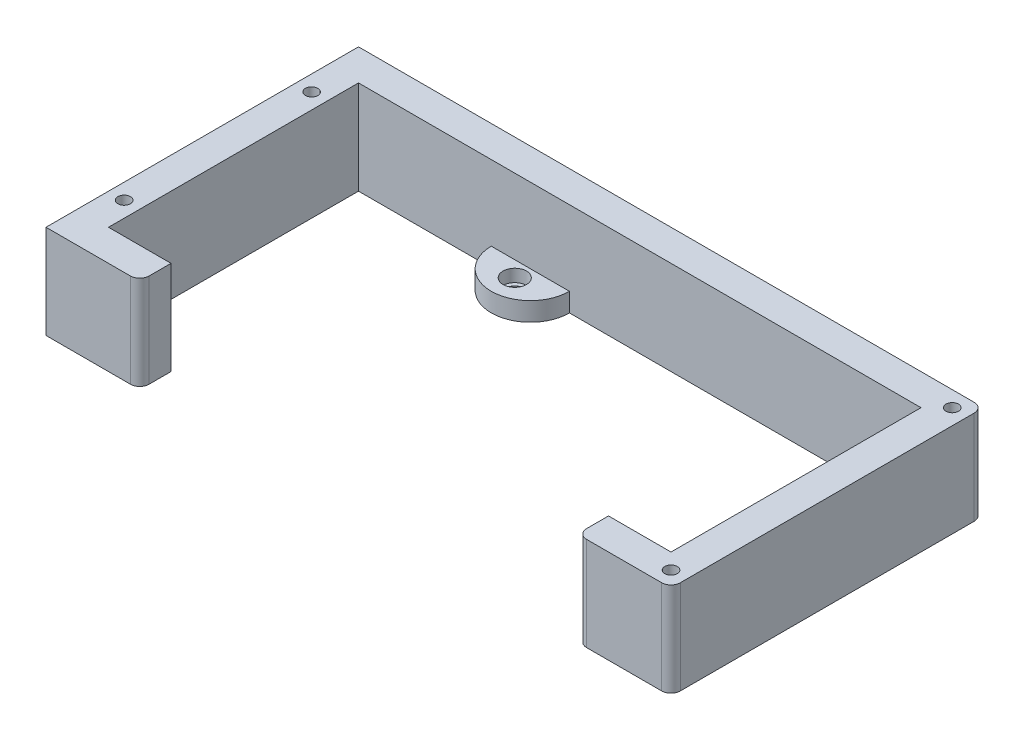
ISO-10303-21;
HEADER;
FILE_DESCRIPTION(('STEP AP214'),'2;1');
FILE_NAME('part.step','',(''),(''),'','','');
FILE_SCHEMA(('AUTOMOTIVE_DESIGN { 1 0 10303 214 1 1 1 1 }'));
ENDSEC;
DATA;
#1=APPLICATION_CONTEXT('core data for automotive mechanical design processes');
#2=APPLICATION_PROTOCOL_DEFINITION('international standard','automotive_design',2000,#1);
#3=PRODUCT_CONTEXT('',#1,'mechanical');
#4=PRODUCT('Part','Part','',(#3));
#5=PRODUCT_RELATED_PRODUCT_CATEGORY('part','',(#4));
#6=PRODUCT_DEFINITION_FORMATION('','',#4);
#7=PRODUCT_DEFINITION_CONTEXT('part definition',#1,'design');
#8=PRODUCT_DEFINITION('design','',#6,#7);
#9=PRODUCT_DEFINITION_SHAPE('','',#8);
#10=(LENGTH_UNIT() NAMED_UNIT(*) SI_UNIT(.MILLI.,.METRE.));
#11=(NAMED_UNIT(*) PLANE_ANGLE_UNIT() SI_UNIT($,.RADIAN.));
#12=(NAMED_UNIT(*) SI_UNIT($,.STERADIAN.) SOLID_ANGLE_UNIT());
#13=UNCERTAINTY_MEASURE_WITH_UNIT(LENGTH_MEASURE(1.E-05),#10,'distance_accuracy_value','');
#14=(GEOMETRIC_REPRESENTATION_CONTEXT(3) GLOBAL_UNCERTAINTY_ASSIGNED_CONTEXT((#13)) GLOBAL_UNIT_ASSIGNED_CONTEXT((#10,
#11,#12)) REPRESENTATION_CONTEXT('',''));
#15=CARTESIAN_POINT('',(0.,0.,0.));
#16=DIRECTION('',(0.,0.,1.));
#17=DIRECTION('',(1.,0.,0.));
#18=AXIS2_PLACEMENT_3D('',#15,#16,#17);
#19=CARTESIAN_POINT('',(-90.,30.,40.));
#20=DIRECTION('',(0.,0.,-1.));
#21=DIRECTION('',(-1.,0.,0.));
#22=AXIS2_PLACEMENT_3D('',#19,#20,#21);
#23=PLANE('',#22);
#24=DIRECTION('',(0.,1.,0.));
#25=VECTOR('',#24,1.);
#26=CARTESIAN_POINT('',(70.,0.,40.));
#27=LINE('',#26,#25);
#28=CARTESIAN_POINT('',(70.,0.,40.));
#29=VERTEX_POINT('',#28);
#30=CARTESIAN_POINT('',(70.,30.,40.));
#31=VERTEX_POINT('',#30);
#32=EDGE_CURVE('E201',#29,#31,#27,.T.);
#33=ORIENTED_EDGE('',*,*,#32,.T.);
#34=DIRECTION('',(1.,0.,0.));
#35=VECTOR('',#34,1.);
#36=CARTESIAN_POINT('',(-90.,30.,40.));
#37=LINE('',#36,#35);
#38=CARTESIAN_POINT('',(90.,30.,40.));
#39=VERTEX_POINT('',#38);
#40=EDGE_CURVE('E419',#31,#39,#37,.T.);
#41=ORIENTED_EDGE('',*,*,#40,.T.);
#42=DIRECTION('',(0.,-1.,0.));
#43=VECTOR('',#42,1.);
#44=CARTESIAN_POINT('',(90.,30.,40.));
#45=LINE('',#44,#43);
#46=CARTESIAN_POINT('',(90.,6.,40.));
#47=VERTEX_POINT('',#46);
#48=EDGE_CURVE('E228',#39,#47,#45,.T.);
#49=ORIENTED_EDGE('',*,*,#48,.T.);
#50=DIRECTION('',(1.,0.,0.));
#51=VECTOR('',#50,1.);
#52=CARTESIAN_POINT('',(77.5,6.,39.9999999999999));
#53=LINE('',#52,#51);
#54=CARTESIAN_POINT('',(77.5,6.,39.9999999999999));
#55=VERTEX_POINT('',#54);
#56=EDGE_CURVE('E387',#55,#47,#53,.T.);
#57=ORIENTED_EDGE('',*,*,#56,.F.);
#58=DIRECTION('',(0.,-1.,0.));
#59=VECTOR('',#58,1.);
#60=CARTESIAN_POINT('',(77.5,6.,39.9999999999999));
#61=LINE('',#60,#59);
#62=CARTESIAN_POINT('',(77.5,0.,39.9999999999999));
#63=VERTEX_POINT('',#62);
#64=EDGE_CURVE('E212',#55,#63,#61,.T.);
#65=ORIENTED_EDGE('',*,*,#64,.T.);
#66=DIRECTION('',(1.,0.,0.));
#67=VECTOR('',#66,1.);
#68=CARTESIAN_POINT('',(-90.,0.,40.));
#69=LINE('',#68,#67);
#70=EDGE_CURVE('E189',#29,#63,#69,.T.);
#71=ORIENTED_EDGE('',*,*,#70,.F.);
#72=EDGE_LOOP('',(#33,#41,#49,#57,#65,#71));
#73=FACE_BOUND('',#72,.T.);
#74=ADVANCED_FACE('F34',(#73),#23,.T.);
#75=CARTESIAN_POINT('',(-100.,30.,50.));
#76=DIRECTION('',(0.,0.,-1.));
#77=DIRECTION('',(-1.,0.,0.));
#78=AXIS2_PLACEMENT_3D('',#75,#76,#77);
#79=PLANE('',#78);
#80=DIRECTION('',(1.,0.,0.));
#81=VECTOR('',#80,1.);
#82=CARTESIAN_POINT('',(-100.,0.,50.));
#83=LINE('',#82,#81);
#84=CARTESIAN_POINT('',(73.,0.,50.));
#85=VERTEX_POINT('',#84);
#86=CARTESIAN_POINT('',(96.9999999999999,0.,50.));
#87=VERTEX_POINT('',#86);
#88=EDGE_CURVE('E256',#85,#87,#83,.T.);
#89=ORIENTED_EDGE('',*,*,#88,.T.);
#90=DIRECTION('',(0.,-1.,0.));
#91=VECTOR('',#90,1.);
#92=CARTESIAN_POINT('',(97.,30.,50.));
#93=LINE('',#92,#91);
#94=CARTESIAN_POINT('',(96.9999999999999,30.,50.));
#95=VERTEX_POINT('',#94);
#96=EDGE_CURVE('E289',#87,#95,#93,.F.);
#97=ORIENTED_EDGE('',*,*,#96,.T.);
#98=DIRECTION('',(1.,0.,0.));
#99=VECTOR('',#98,1.);
#100=CARTESIAN_POINT('',(-100.,30.,50.));
#101=LINE('',#100,#99);
#102=CARTESIAN_POINT('',(73.,30.,50.));
#103=VERTEX_POINT('',#102);
#104=EDGE_CURVE('E246',#103,#95,#101,.T.);
#105=ORIENTED_EDGE('',*,*,#104,.F.);
#106=DIRECTION('',(0.,1.,0.));
#107=VECTOR('',#106,1.);
#108=CARTESIAN_POINT('',(73.,30.,50.));
#109=LINE('',#108,#107);
#110=EDGE_CURVE('E287',#103,#85,#109,.F.);
#111=ORIENTED_EDGE('',*,*,#110,.T.);
#112=EDGE_LOOP('',(#89,#97,#105,#111));
#113=FACE_BOUND('',#112,.T.);
#114=ADVANCED_FACE('F456',(#113),#79,.F.);
#115=CARTESIAN_POINT('',(85.,6.,-35.));
#116=DIRECTION('',(0.,-1.,0.));
#117=DIRECTION('',(0.,0.,-1.));
#118=AXIS2_PLACEMENT_3D('',#115,#116,#117);
#119=CYLINDRICAL_SURFACE('',#118,2.50000000000001);
#120=CARTESIAN_POINT('',(85.,0.,-35.));
#121=DIRECTION('',(0.,1.,0.));
#122=DIRECTION('',(0.,0.,1.));
#123=AXIS2_PLACEMENT_3D('',#120,#121,#122);
#124=CIRCLE('',#123,2.50000000000001);
#125=CARTESIAN_POINT('',(85.,0.,-32.5));
#126=VERTEX_POINT('',#125);
#127=EDGE_CURVE('E398',#126,#126,#124,.T.);
#128=ORIENTED_EDGE('',*,*,#127,.F.);
#129=EDGE_LOOP('',(#128));
#130=FACE_BOUND('',#129,.T.);
#131=CARTESIAN_POINT('',(85.,2.,-35.));
#132=DIRECTION('',(0.,1.,0.));
#133=DIRECTION('',(0.,0.,1.));
#134=AXIS2_PLACEMENT_3D('',#131,#132,#133);
#135=CIRCLE('',#134,2.50000000000001);
#136=CARTESIAN_POINT('',(85.,2.,-32.5));
#137=VERTEX_POINT('',#136);
#138=EDGE_CURVE('E272',#137,#137,#135,.T.);
#139=ORIENTED_EDGE('',*,*,#138,.T.);
#140=EDGE_LOOP('',(#139));
#141=FACE_BOUND('',#140,.T.);
#142=ADVANCED_FACE('F460',(#130,#141),#119,.F.);
#143=CARTESIAN_POINT('',(-35.,6.,-35.));
#144=DIRECTION('',(0.,-1.,0.));
#145=DIRECTION('',(0.,0.,-1.));
#146=AXIS2_PLACEMENT_3D('',#143,#144,#145);
#147=CYLINDRICAL_SURFACE('',#146,2.5);
#148=CARTESIAN_POINT('',(-35.,0.,-35.));
#149=DIRECTION('',(0.,1.,0.));
#150=DIRECTION('',(0.,0.,1.));
#151=AXIS2_PLACEMENT_3D('',#148,#149,#150);
#152=CIRCLE('',#151,2.5);
#153=CARTESIAN_POINT('',(-35.,0.,-32.5));
#154=VERTEX_POINT('',#153);
#155=EDGE_CURVE('E275',#154,#154,#152,.T.);
#156=ORIENTED_EDGE('',*,*,#155,.F.);
#157=EDGE_LOOP('',(#156));
#158=FACE_BOUND('',#157,.T.);
#159=CARTESIAN_POINT('',(-35.,2.,-35.));
#160=DIRECTION('',(0.,1.,0.));
#161=DIRECTION('',(0.,0.,1.));
#162=AXIS2_PLACEMENT_3D('',#159,#160,#161);
#163=CIRCLE('',#162,2.5);
#164=CARTESIAN_POINT('',(-35.,2.,-32.5));
#165=VERTEX_POINT('',#164);
#166=EDGE_CURVE('E265',#165,#165,#163,.T.);
#167=ORIENTED_EDGE('',*,*,#166,.T.);
#168=EDGE_LOOP('',(#167));
#169=FACE_BOUND('',#168,.T.);
#170=ADVANCED_FACE('F452',(#158,#169),#147,.F.);
#171=CARTESIAN_POINT('',(-90.,30.,-40.));
#172=DIRECTION('',(0.,0.,1.));
#173=DIRECTION('',(1.,0.,0.));
#174=AXIS2_PLACEMENT_3D('',#171,#172,#173);
#175=PLANE('',#174);
#176=DIRECTION('',(-1.,0.,0.));
#177=VECTOR('',#176,1.);
#178=CARTESIAN_POINT('',(-90.,0.,-40.));
#179=LINE('',#178,#177);
#180=CARTESIAN_POINT('',(-47.5,0.,-39.999999999996));
#181=VERTEX_POINT('',#180);
#182=CARTESIAN_POINT('',(-90.,0.,-40.));
#183=VERTEX_POINT('',#182);
#184=EDGE_CURVE('E415',#181,#183,#179,.T.);
#185=ORIENTED_EDGE('',*,*,#184,.F.);
#186=DIRECTION('',(0.,-1.,0.));
#187=VECTOR('',#186,1.);
#188=CARTESIAN_POINT('',(-47.5,6.,-39.999999999996));
#189=LINE('',#188,#187);
#190=CARTESIAN_POINT('',(-47.5,6.,-39.999999999996));
#191=VERTEX_POINT('',#190);
#192=EDGE_CURVE('E377',#191,#181,#189,.T.);
#193=ORIENTED_EDGE('',*,*,#192,.F.);
#194=DIRECTION('',(-1.,0.,0.));
#195=VECTOR('',#194,1.);
#196=CARTESIAN_POINT('',(-47.5,6.,-39.999999999996));
#197=LINE('',#196,#195);
#198=CARTESIAN_POINT('',(-22.5,6.,-39.999999999996));
#199=VERTEX_POINT('',#198);
#200=EDGE_CURVE('E375',#199,#191,#197,.T.);
#201=ORIENTED_EDGE('',*,*,#200,.F.);
#202=DIRECTION('',(0.,-1.,0.));
#203=VECTOR('',#202,1.);
#204=CARTESIAN_POINT('',(-22.5,6.,-39.999999999996));
#205=LINE('',#204,#203);
#206=CARTESIAN_POINT('',(-22.5,0.,-40.));
#207=VERTEX_POINT('',#206);
#208=EDGE_CURVE('E380',#199,#207,#205,.T.);
#209=ORIENTED_EDGE('',*,*,#208,.T.);
#210=CARTESIAN_POINT('',(77.5,0.,-39.9999999999999));
#211=VERTEX_POINT('',#210);
#212=EDGE_CURVE('E219',#211,#207,#179,.T.);
#213=ORIENTED_EDGE('',*,*,#212,.F.);
#214=DIRECTION('',(0.,-1.,0.));
#215=VECTOR('',#214,1.);
#216=CARTESIAN_POINT('',(77.5,6.,-39.9999999999999));
#217=LINE('',#216,#215);
#218=CARTESIAN_POINT('',(77.5,6.,-39.9999999999999));
#219=VERTEX_POINT('',#218);
#220=EDGE_CURVE('E413',#219,#211,#217,.T.);
#221=ORIENTED_EDGE('',*,*,#220,.F.);
#222=DIRECTION('',(-1.,0.,0.));
#223=VECTOR('',#222,1.);
#224=CARTESIAN_POINT('',(77.5,6.,-39.9999999999999));
#225=LINE('',#224,#223);
#226=CARTESIAN_POINT('',(90.,6.,-40.));
#227=VERTEX_POINT('',#226);
#228=EDGE_CURVE('E404',#227,#219,#225,.T.);
#229=ORIENTED_EDGE('',*,*,#228,.F.);
#230=DIRECTION('',(0.,-1.,0.));
#231=VECTOR('',#230,1.);
#232=CARTESIAN_POINT('',(90.,30.,-40.));
#233=LINE('',#232,#231);
#234=CARTESIAN_POINT('',(90.,30.,-40.));
#235=VERTEX_POINT('',#234);
#236=EDGE_CURVE('E225',#235,#227,#233,.T.);
#237=ORIENTED_EDGE('',*,*,#236,.F.);
#238=DIRECTION('',(-1.,0.,0.));
#239=VECTOR('',#238,1.);
#240=CARTESIAN_POINT('',(-90.,30.,-40.));
#241=LINE('',#240,#239);
#242=CARTESIAN_POINT('',(-90.,30.,-40.));
#243=VERTEX_POINT('',#242);
#244=EDGE_CURVE('E224',#235,#243,#241,.T.);
#245=ORIENTED_EDGE('',*,*,#244,.T.);
#246=DIRECTION('',(0.,-1.,0.));
#247=VECTOR('',#246,1.);
#248=CARTESIAN_POINT('',(-90.,30.,-40.));
#249=LINE('',#248,#247);
#250=EDGE_CURVE('E234',#243,#183,#249,.T.);
#251=ORIENTED_EDGE('',*,*,#250,.T.);
#252=EDGE_LOOP('',(#185,#193,#201,#209,#213,#221,#229,#237,#245,#251));
#253=FACE_BOUND('',#252,.T.);
#254=ADVANCED_FACE('F436',(#253),#175,.T.);
#255=DIRECTION('',(0.,1.,0.));
#256=VECTOR('',#255,1.);
#257=CARTESIAN_POINT('',(-70.,0.,40.));
#258=LINE('',#257,#256);
#259=CARTESIAN_POINT('',(-70.,0.,40.));
#260=VERTEX_POINT('',#259);
#261=CARTESIAN_POINT('',(-70.,30.,40.));
#262=VERTEX_POINT('',#261);
#263=EDGE_CURVE('E207',#260,#262,#258,.T.);
#264=ORIENTED_EDGE('',*,*,#263,.F.);
#265=CARTESIAN_POINT('',(-90.,0.,40.));
#266=VERTEX_POINT('',#265);
#267=EDGE_CURVE('E213',#266,#260,#69,.T.);
#268=ORIENTED_EDGE('',*,*,#267,.F.);
#269=DIRECTION('',(0.,-1.,0.));
#270=VECTOR('',#269,1.);
#271=CARTESIAN_POINT('',(-90.,30.,40.));
#272=LINE('',#271,#270);
#273=CARTESIAN_POINT('',(-90.,30.,40.));
#274=VERTEX_POINT('',#273);
#275=EDGE_CURVE('E232',#274,#266,#272,.T.);
#276=ORIENTED_EDGE('',*,*,#275,.F.);
#277=EDGE_CURVE('E420',#274,#262,#37,.T.);
#278=ORIENTED_EDGE('',*,*,#277,.T.);
#279=EDGE_LOOP('',(#264,#268,#276,#278));
#280=FACE_BOUND('',#279,.T.);
#281=ADVANCED_FACE('F442',(#280),#23,.T.);
#282=CARTESIAN_POINT('',(90.,30.,-40.));
#283=DIRECTION('',(-1.,0.,0.));
#284=DIRECTION('',(0.,0.,1.));
#285=AXIS2_PLACEMENT_3D('',#282,#283,#284);
#286=PLANE('',#285);
#287=DIRECTION('',(0.,-1.,0.));
#288=VECTOR('',#287,1.);
#289=CARTESIAN_POINT('',(90.0000000000001,6.,27.5));
#290=LINE('',#289,#288);
#291=CARTESIAN_POINT('',(90.,6.,27.5));
#292=VERTEX_POINT('',#291);
#293=CARTESIAN_POINT('',(90.0000000000001,0.,27.5));
#294=VERTEX_POINT('',#293);
#295=EDGE_CURVE('E396',#292,#294,#290,.T.);
#296=ORIENTED_EDGE('',*,*,#295,.F.);
#297=DIRECTION('',(0.,0.,-1.));
#298=VECTOR('',#297,1.);
#299=CARTESIAN_POINT('',(90.,6.,40.));
#300=LINE('',#299,#298);
#301=EDGE_CURVE('E389',#47,#292,#300,.T.);
#302=ORIENTED_EDGE('',*,*,#301,.F.);
#303=ORIENTED_EDGE('',*,*,#48,.F.);
#304=DIRECTION('',(0.,0.,-1.));
#305=VECTOR('',#304,1.);
#306=CARTESIAN_POINT('',(90.,30.,-40.));
#307=LINE('',#306,#305);
#308=EDGE_CURVE('E229',#39,#235,#307,.T.);
#309=ORIENTED_EDGE('',*,*,#308,.T.);
#310=ORIENTED_EDGE('',*,*,#236,.T.);
#311=DIRECTION('',(0.,0.,-1.));
#312=VECTOR('',#311,1.);
#313=CARTESIAN_POINT('',(90.,6.,-40.));
#314=LINE('',#313,#312);
#315=CARTESIAN_POINT('',(90.,6.,-27.5));
#316=VERTEX_POINT('',#315);
#317=EDGE_CURVE('E402',#316,#227,#314,.T.);
#318=ORIENTED_EDGE('',*,*,#317,.F.);
#319=DIRECTION('',(0.,-1.,0.));
#320=VECTOR('',#319,1.);
#321=CARTESIAN_POINT('',(90.,6.,-27.5));
#322=LINE('',#321,#320);
#323=CARTESIAN_POINT('',(90.,0.,-27.5));
#324=VERTEX_POINT('',#323);
#325=EDGE_CURVE('E408',#316,#324,#322,.T.);
#326=ORIENTED_EDGE('',*,*,#325,.T.);
#327=DIRECTION('',(0.,0.,-1.));
#328=VECTOR('',#327,1.);
#329=CARTESIAN_POINT('',(90.,0.,-40.));
#330=LINE('',#329,#328);
#331=EDGE_CURVE('E217',#294,#324,#330,.T.);
#332=ORIENTED_EDGE('',*,*,#331,.F.);
#333=EDGE_LOOP('',(#296,#302,#303,#309,#310,#318,#326,#332));
#334=FACE_BOUND('',#333,.T.);
#335=ADVANCED_FACE('F444',(#334),#286,.T.);
#336=CARTESIAN_POINT('',(0.,30.,0.));
#337=DIRECTION('',(0.,1.,0.));
#338=DIRECTION('',(0.,0.,1.));
#339=AXIS2_PLACEMENT_3D('',#336,#337,#338);
#340=PLANE('',#339);
#341=ORIENTED_EDGE('',*,*,#104,.T.);
#342=CARTESIAN_POINT('',(97.,30.,47.));
#343=DIRECTION('',(0.,1.,0.));
#344=DIRECTION('',(0.,0.,1.));
#345=AXIS2_PLACEMENT_3D('',#342,#343,#344);
#346=CIRCLE('',#345,3.);
#347=CARTESIAN_POINT('',(100.,30.,47.));
#348=VERTEX_POINT('',#347);
#349=EDGE_CURVE('E296',#95,#348,#346,.T.);
#350=ORIENTED_EDGE('',*,*,#349,.T.);
#351=DIRECTION('',(0.,0.,-1.));
#352=VECTOR('',#351,1.);
#353=CARTESIAN_POINT('',(100.,30.,-50.));
#354=LINE('',#353,#352);
#355=CARTESIAN_POINT('',(100.,30.,-47.));
#356=VERTEX_POINT('',#355);
#357=EDGE_CURVE('E238',#348,#356,#354,.T.);
#358=ORIENTED_EDGE('',*,*,#357,.T.);
#359=CARTESIAN_POINT('',(97.,30.,-47.));
#360=DIRECTION('',(0.,1.,0.));
#361=DIRECTION('',(0.,0.,1.));
#362=AXIS2_PLACEMENT_3D('',#359,#360,#361);
#363=CIRCLE('',#362,3.);
#364=CARTESIAN_POINT('',(97.,30.,-50.));
#365=VERTEX_POINT('',#364);
#366=EDGE_CURVE('E294',#356,#365,#363,.T.);
#367=ORIENTED_EDGE('',*,*,#366,.T.);
#368=DIRECTION('',(-1.,0.,0.));
#369=VECTOR('',#368,1.);
#370=CARTESIAN_POINT('',(-100.,30.,-50.));
#371=LINE('',#370,#369);
#372=CARTESIAN_POINT('',(-100.,30.,-50.));
#373=VERTEX_POINT('',#372);
#374=EDGE_CURVE('E241',#365,#373,#371,.T.);
#375=ORIENTED_EDGE('',*,*,#374,.T.);
#376=DIRECTION('',(0.,0.,1.));
#377=VECTOR('',#376,1.);
#378=CARTESIAN_POINT('',(-100.,30.,-50.));
#379=LINE('',#378,#377);
#380=CARTESIAN_POINT('',(-100.,30.,50.));
#381=VERTEX_POINT('',#380);
#382=EDGE_CURVE('E244',#373,#381,#379,.T.);
#383=ORIENTED_EDGE('',*,*,#382,.T.);
#384=CARTESIAN_POINT('',(-73.,30.,50.));
#385=VERTEX_POINT('',#384);
#386=EDGE_CURVE('E247',#381,#385,#101,.T.);
#387=ORIENTED_EDGE('',*,*,#386,.T.);
#388=CARTESIAN_POINT('',(-73.,30.,47.));
#389=DIRECTION('',(0.,1.,0.));
#390=DIRECTION('',(0.,0.,1.));
#391=AXIS2_PLACEMENT_3D('',#388,#389,#390);
#392=CIRCLE('',#391,3.);
#393=CARTESIAN_POINT('',(-70.,30.,47.));
#394=VERTEX_POINT('',#393);
#395=EDGE_CURVE('E49',#385,#394,#392,.T.);
#396=ORIENTED_EDGE('',*,*,#395,.T.);
#397=DIRECTION('',(0.,0.,1.));
#398=VECTOR('',#397,1.);
#399=CARTESIAN_POINT('',(-70.,30.,40.));
#400=LINE('',#399,#398);
#401=EDGE_CURVE('E198',#262,#394,#400,.T.);
#402=ORIENTED_EDGE('',*,*,#401,.F.);
#403=ORIENTED_EDGE('',*,*,#277,.F.);
#404=DIRECTION('',(0.,0.,1.));
#405=VECTOR('',#404,1.);
#406=CARTESIAN_POINT('',(-90.,30.,-40.));
#407=LINE('',#406,#405);
#408=EDGE_CURVE('E417',#243,#274,#407,.T.);
#409=ORIENTED_EDGE('',*,*,#408,.F.);
#410=ORIENTED_EDGE('',*,*,#244,.F.);
#411=ORIENTED_EDGE('',*,*,#308,.F.);
#412=ORIENTED_EDGE('',*,*,#40,.F.);
#413=DIRECTION('',(0.,0.,-1.));
#414=VECTOR('',#413,1.);
#415=CARTESIAN_POINT('',(70.,30.,40.));
#416=LINE('',#415,#414);
#417=CARTESIAN_POINT('',(70.,30.,47.));
#418=VERTEX_POINT('',#417);
#419=EDGE_CURVE('E204',#418,#31,#416,.T.);
#420=ORIENTED_EDGE('',*,*,#419,.F.);
#421=CARTESIAN_POINT('',(73.,30.,47.));
#422=DIRECTION('',(0.,1.,0.));
#423=DIRECTION('',(0.,0.,1.));
#424=AXIS2_PLACEMENT_3D('',#421,#422,#423);
#425=CIRCLE('',#424,3.);
#426=EDGE_CURVE('E292',#418,#103,#425,.T.);
#427=ORIENTED_EDGE('',*,*,#426,.T.);
#428=EDGE_LOOP('',(#341,#350,#358,#367,#375,#383,#387,#396,#402,#403,#409,#410,#411,#412,#420,#427));
#429=FACE_BOUND('',#428,.T.);
#430=CARTESIAN_POINT('',(95.,30.,-45.));
#431=DIRECTION('',(0.,1.,0.));
#432=DIRECTION('',(0.,0.,1.));
#433=AXIS2_PLACEMENT_3D('',#430,#431,#432);
#434=CIRCLE('',#433,2.);
#435=CARTESIAN_POINT('',(95.,30.,-43.));
#436=VERTEX_POINT('',#435);
#437=EDGE_CURVE('E334',#436,#436,#434,.T.);
#438=ORIENTED_EDGE('',*,*,#437,.F.);
#439=EDGE_LOOP('',(#438));
#440=FACE_BOUND('',#439,.T.);
#441=CARTESIAN_POINT('',(-95.,30.,30.));
#442=DIRECTION('',(0.,1.,0.));
#443=DIRECTION('',(0.,0.,-1.));
#444=AXIS2_PLACEMENT_3D('',#441,#442,#443);
#445=CIRCLE('',#444,2.);
#446=CARTESIAN_POINT('',(-95.,30.,28.));
#447=VERTEX_POINT('',#446);
#448=EDGE_CURVE('E328',#447,#447,#445,.T.);
#449=ORIENTED_EDGE('',*,*,#448,.F.);
#450=EDGE_LOOP('',(#449));
#451=FACE_BOUND('',#450,.T.);
#452=CARTESIAN_POINT('',(-95.,30.,-30.));
#453=DIRECTION('',(0.,1.,0.));
#454=DIRECTION('',(0.,0.,1.));
#455=AXIS2_PLACEMENT_3D('',#452,#453,#454);
#456=CIRCLE('',#455,2.);
#457=CARTESIAN_POINT('',(-95.,30.,-28.));
#458=VERTEX_POINT('',#457);
#459=EDGE_CURVE('E341',#458,#458,#456,.T.);
#460=ORIENTED_EDGE('',*,*,#459,.F.);
#461=EDGE_LOOP('',(#460));
#462=FACE_BOUND('',#461,.T.);
#463=CARTESIAN_POINT('',(95.,30.,45.));
#464=DIRECTION('',(0.,1.,0.));
#465=DIRECTION('',(0.,0.,-1.));
#466=AXIS2_PLACEMENT_3D('',#463,#464,#465);
#467=CIRCLE('',#466,2.);
#468=CARTESIAN_POINT('',(95.,30.,43.));
#469=VERTEX_POINT('',#468);
#470=EDGE_CURVE('E346',#469,#469,#467,.T.);
#471=ORIENTED_EDGE('',*,*,#470,.F.);
#472=EDGE_LOOP('',(#471));
#473=FACE_BOUND('',#472,.T.);
#474=ADVANCED_FACE('F308',(#429,#440,#451,#462,#473),#340,.T.);
#475=CARTESIAN_POINT('',(0.,0.,0.));
#476=DIRECTION('',(0.,1.,0.));
#477=DIRECTION('',(0.,0.,1.));
#478=AXIS2_PLACEMENT_3D('',#475,#476,#477);
#479=PLANE('',#478);
#480=DIRECTION('',(0.,0.,-1.));
#481=VECTOR('',#480,1.);
#482=CARTESIAN_POINT('',(100.,0.,-50.));
#483=LINE('',#482,#481);
#484=CARTESIAN_POINT('',(100.,0.,47.));
#485=VERTEX_POINT('',#484);
#486=CARTESIAN_POINT('',(100.,0.,-47.));
#487=VERTEX_POINT('',#486);
#488=EDGE_CURVE('E237',#485,#487,#483,.T.);
#489=ORIENTED_EDGE('',*,*,#488,.F.);
#490=CARTESIAN_POINT('',(97.,0.,47.));
#491=DIRECTION('',(0.,1.,0.));
#492=DIRECTION('',(0.,0.,1.));
#493=AXIS2_PLACEMENT_3D('',#490,#491,#492);
#494=CIRCLE('',#493,3.);
#495=EDGE_CURVE('E285',#485,#87,#494,.F.);
#496=ORIENTED_EDGE('',*,*,#495,.T.);
#497=ORIENTED_EDGE('',*,*,#88,.F.);
#498=CARTESIAN_POINT('',(73.,0.,47.));
#499=DIRECTION('',(0.,1.,0.));
#500=DIRECTION('',(0.,0.,1.));
#501=AXIS2_PLACEMENT_3D('',#498,#499,#500);
#502=CIRCLE('',#501,3.);
#503=CARTESIAN_POINT('',(70.,0.,47.));
#504=VERTEX_POINT('',#503);
#505=EDGE_CURVE('E193',#85,#504,#502,.F.);
#506=ORIENTED_EDGE('',*,*,#505,.T.);
#507=DIRECTION('',(0.,0.,-1.));
#508=VECTOR('',#507,1.);
#509=CARTESIAN_POINT('',(70.,0.,40.));
#510=LINE('',#509,#508);
#511=EDGE_CURVE('E182',#504,#29,#510,.T.);
#512=ORIENTED_EDGE('',*,*,#511,.T.);
#513=ORIENTED_EDGE('',*,*,#70,.T.);
#514=CARTESIAN_POINT('',(90.,0.,40.));
#515=DIRECTION('',(0.,1.,0.));
#516=DIRECTION('',(0.,0.,-1.));
#517=AXIS2_PLACEMENT_3D('',#514,#515,#516);
#518=CIRCLE('',#517,12.5);
#519=EDGE_CURVE('E386',#294,#63,#518,.T.);
#520=ORIENTED_EDGE('',*,*,#519,.F.);
#521=ORIENTED_EDGE('',*,*,#331,.T.);
#522=CARTESIAN_POINT('',(90.,0.,-40.));
#523=DIRECTION('',(0.,1.,0.));
#524=DIRECTION('',(0.,0.,1.));
#525=AXIS2_PLACEMENT_3D('',#522,#523,#524);
#526=CIRCLE('',#525,12.5);
#527=EDGE_CURVE('E401',#211,#324,#526,.T.);
#528=ORIENTED_EDGE('',*,*,#527,.F.);
#529=ORIENTED_EDGE('',*,*,#212,.T.);
#530=CARTESIAN_POINT('',(-35.,0.,-39.999999999996));
#531=DIRECTION('',(0.,1.,0.));
#532=DIRECTION('',(0.,0.,1.));
#533=AXIS2_PLACEMENT_3D('',#530,#531,#532);
#534=CIRCLE('',#533,12.5);
#535=EDGE_CURVE('E372',#181,#207,#534,.T.);
#536=ORIENTED_EDGE('',*,*,#535,.F.);
#537=ORIENTED_EDGE('',*,*,#184,.T.);
#538=DIRECTION('',(0.,0.,1.));
#539=VECTOR('',#538,1.);
#540=CARTESIAN_POINT('',(-90.,0.,-40.));
#541=LINE('',#540,#539);
#542=EDGE_CURVE('E214',#183,#266,#541,.T.);
#543=ORIENTED_EDGE('',*,*,#542,.T.);
#544=ORIENTED_EDGE('',*,*,#267,.T.);
#545=DIRECTION('',(0.,0.,1.));
#546=VECTOR('',#545,1.);
#547=CARTESIAN_POINT('',(-70.,0.,40.));
#548=LINE('',#547,#546);
#549=CARTESIAN_POINT('',(-70.,0.,47.));
#550=VERTEX_POINT('',#549);
#551=EDGE_CURVE('E197',#260,#550,#548,.T.);
#552=ORIENTED_EDGE('',*,*,#551,.T.);
#553=CARTESIAN_POINT('',(-73.,0.,47.));
#554=DIRECTION('',(0.,1.,0.));
#555=DIRECTION('',(0.,0.,1.));
#556=AXIS2_PLACEMENT_3D('',#553,#554,#555);
#557=CIRCLE('',#556,3.);
#558=CARTESIAN_POINT('',(-73.,0.,50.));
#559=VERTEX_POINT('',#558);
#560=EDGE_CURVE('E280',#550,#559,#557,.F.);
#561=ORIENTED_EDGE('',*,*,#560,.T.);
#562=CARTESIAN_POINT('',(-100.,0.,50.));
#563=VERTEX_POINT('',#562);
#564=EDGE_CURVE('E242',#563,#559,#83,.T.);
#565=ORIENTED_EDGE('',*,*,#564,.F.);
#566=DIRECTION('',(0.,0.,1.));
#567=VECTOR('',#566,1.);
#568=CARTESIAN_POINT('',(-100.,0.,-50.));
#569=LINE('',#568,#567);
#570=CARTESIAN_POINT('',(-100.,0.,-50.));
#571=VERTEX_POINT('',#570);
#572=EDGE_CURVE('E254',#571,#563,#569,.T.);
#573=ORIENTED_EDGE('',*,*,#572,.F.);
#574=DIRECTION('',(-1.,0.,0.));
#575=VECTOR('',#574,1.);
#576=CARTESIAN_POINT('',(-100.,0.,-50.));
#577=LINE('',#576,#575);
#578=CARTESIAN_POINT('',(97.,0.,-50.));
#579=VERTEX_POINT('',#578);
#580=EDGE_CURVE('E252',#579,#571,#577,.T.);
#581=ORIENTED_EDGE('',*,*,#580,.F.);
#582=CARTESIAN_POINT('',(97.,0.,-47.));
#583=DIRECTION('',(0.,1.,0.));
#584=DIRECTION('',(0.,0.,1.));
#585=AXIS2_PLACEMENT_3D('',#582,#583,#584);
#586=CIRCLE('',#585,3.);
#587=EDGE_CURVE('E283',#579,#487,#586,.F.);
#588=ORIENTED_EDGE('',*,*,#587,.T.);
#589=EDGE_LOOP('',(#489,#496,#497,#506,#512,#513,#520,#521,#528,#529,#536,#537,#543,#544,#552,
#561,#565,#573,#581,#588));
#590=FACE_BOUND('',#589,.T.);
#591=ORIENTED_EDGE('',*,*,#127,.T.);
#592=EDGE_LOOP('',(#591));
#593=FACE_BOUND('',#592,.T.);
#594=CARTESIAN_POINT('',(85.,0.,35.));
#595=DIRECTION('',(0.,1.,0.));
#596=DIRECTION('',(0.,0.,-1.));
#597=AXIS2_PLACEMENT_3D('',#594,#595,#596);
#598=CIRCLE('',#597,2.50000000000001);
#599=CARTESIAN_POINT('',(85.,0.,32.5));
#600=VERTEX_POINT('',#599);
#601=EDGE_CURVE('E383',#600,#600,#598,.T.);
#602=ORIENTED_EDGE('',*,*,#601,.T.);
#603=EDGE_LOOP('',(#602));
#604=FACE_BOUND('',#603,.T.);
#605=ORIENTED_EDGE('',*,*,#155,.T.);
#606=EDGE_LOOP('',(#605));
#607=FACE_BOUND('',#606,.T.);
#608=ADVANCED_FACE('F185',(#590,#593,#604,#607),#479,.F.);
#609=CARTESIAN_POINT('',(100.,30.,-50.));
#610=DIRECTION('',(-1.,0.,0.));
#611=DIRECTION('',(0.,0.,1.));
#612=AXIS2_PLACEMENT_3D('',#609,#610,#611);
#613=PLANE('',#612);
#614=ORIENTED_EDGE('',*,*,#357,.F.);
#615=DIRECTION('',(0.,-1.,0.));
#616=VECTOR('',#615,1.);
#617=CARTESIAN_POINT('',(100.,30.,47.));
#618=LINE('',#617,#616);
#619=EDGE_CURVE('E277',#348,#485,#618,.T.);
#620=ORIENTED_EDGE('',*,*,#619,.T.);
#621=ORIENTED_EDGE('',*,*,#488,.T.);
#622=DIRECTION('',(0.,-1.,0.));
#623=VECTOR('',#622,1.);
#624=CARTESIAN_POINT('',(100.,30.,-47.));
#625=LINE('',#624,#623);
#626=EDGE_CURVE('E264',#487,#356,#625,.F.);
#627=ORIENTED_EDGE('',*,*,#626,.T.);
#628=EDGE_LOOP('',(#614,#620,#621,#627));
#629=FACE_BOUND('',#628,.T.);
#630=ADVANCED_FACE('F481',(#629),#613,.F.);
#631=CARTESIAN_POINT('',(-100.,30.,-50.));
#632=DIRECTION('',(0.,0.,1.));
#633=DIRECTION('',(1.,0.,0.));
#634=AXIS2_PLACEMENT_3D('',#631,#632,#633);
#635=PLANE('',#634);
#636=ORIENTED_EDGE('',*,*,#374,.F.);
#637=DIRECTION('',(0.,-1.,0.));
#638=VECTOR('',#637,1.);
#639=CARTESIAN_POINT('',(97.,30.,-50.));
#640=LINE('',#639,#638);
#641=EDGE_CURVE('E298',#365,#579,#640,.T.);
#642=ORIENTED_EDGE('',*,*,#641,.T.);
#643=ORIENTED_EDGE('',*,*,#580,.T.);
#644=DIRECTION('',(0.,-1.,0.));
#645=VECTOR('',#644,1.);
#646=CARTESIAN_POINT('',(-100.,30.,-50.));
#647=LINE('',#646,#645);
#648=EDGE_CURVE('E261',#373,#571,#647,.T.);
#649=ORIENTED_EDGE('',*,*,#648,.F.);
#650=EDGE_LOOP('',(#636,#642,#643,#649));
#651=FACE_BOUND('',#650,.T.);
#652=ADVANCED_FACE('F477',(#651),#635,.F.);
#653=CARTESIAN_POINT('',(-100.,30.,-50.));
#654=DIRECTION('',(1.,0.,0.));
#655=DIRECTION('',(0.,0.,-1.));
#656=AXIS2_PLACEMENT_3D('',#653,#654,#655);
#657=PLANE('',#656);
#658=ORIENTED_EDGE('',*,*,#572,.T.);
#659=DIRECTION('',(0.,-1.,0.));
#660=VECTOR('',#659,1.);
#661=CARTESIAN_POINT('',(-100.,30.,50.));
#662=LINE('',#661,#660);
#663=EDGE_CURVE('E249',#381,#563,#662,.T.);
#664=ORIENTED_EDGE('',*,*,#663,.F.);
#665=ORIENTED_EDGE('',*,*,#382,.F.);
#666=ORIENTED_EDGE('',*,*,#648,.T.);
#667=EDGE_LOOP('',(#658,#664,#665,#666));
#668=FACE_BOUND('',#667,.T.);
#669=ADVANCED_FACE('F315',(#668),#657,.F.);
#670=ORIENTED_EDGE('',*,*,#564,.T.);
#671=DIRECTION('',(0.,1.,0.));
#672=VECTOR('',#671,1.);
#673=CARTESIAN_POINT('',(-73.,30.,50.));
#674=LINE('',#673,#672);
#675=EDGE_CURVE('E42',#559,#385,#674,.T.);
#676=ORIENTED_EDGE('',*,*,#675,.T.);
#677=ORIENTED_EDGE('',*,*,#386,.F.);
#678=ORIENTED_EDGE('',*,*,#663,.T.);
#679=EDGE_LOOP('',(#670,#676,#677,#678));
#680=FACE_BOUND('',#679,.T.);
#681=ADVANCED_FACE('F304',(#680),#79,.F.);
#682=CARTESIAN_POINT('',(-90.,30.,-40.));
#683=DIRECTION('',(1.,0.,0.));
#684=DIRECTION('',(0.,0.,-1.));
#685=AXIS2_PLACEMENT_3D('',#682,#683,#684);
#686=PLANE('',#685);
#687=ORIENTED_EDGE('',*,*,#542,.F.);
#688=ORIENTED_EDGE('',*,*,#250,.F.);
#689=ORIENTED_EDGE('',*,*,#408,.T.);
#690=ORIENTED_EDGE('',*,*,#275,.T.);
#691=EDGE_LOOP('',(#687,#688,#689,#690));
#692=FACE_BOUND('',#691,.T.);
#693=ADVANCED_FACE('F432',(#692),#686,.T.);
#694=CARTESIAN_POINT('',(90.,6.,-40.));
#695=DIRECTION('',(0.,1.,0.));
#696=DIRECTION('',(0.,0.,1.));
#697=AXIS2_PLACEMENT_3D('',#694,#695,#696);
#698=PLANE('',#697);
#699=CARTESIAN_POINT('',(85.,6.,-35.));
#700=DIRECTION('',(0.,1.,0.));
#701=DIRECTION('',(0.,0.,1.));
#702=AXIS2_PLACEMENT_3D('',#699,#700,#701);
#703=CIRCLE('',#702,3.75000000000001);
#704=CARTESIAN_POINT('',(85.,6.,-31.25));
#705=VERTEX_POINT('',#704);
#706=EDGE_CURVE('E362',#705,#705,#703,.T.);
#707=ORIENTED_EDGE('',*,*,#706,.F.);
#708=EDGE_LOOP('',(#707));
#709=FACE_BOUND('',#708,.T.);
#710=ORIENTED_EDGE('',*,*,#317,.T.);
#711=ORIENTED_EDGE('',*,*,#228,.T.);
#712=CARTESIAN_POINT('',(90.,6.,-40.));
#713=DIRECTION('',(0.,1.,0.));
#714=DIRECTION('',(0.,0.,1.));
#715=AXIS2_PLACEMENT_3D('',#712,#713,#714);
#716=CIRCLE('',#715,12.5);
#717=EDGE_CURVE('E406',#219,#316,#716,.T.);
#718=ORIENTED_EDGE('',*,*,#717,.T.);
#719=EDGE_LOOP('',(#710,#711,#718));
#720=FACE_BOUND('',#719,.T.);
#721=ADVANCED_FACE('F476',(#709,#720),#698,.T.);
#722=CARTESIAN_POINT('',(90.,6.,-40.));
#723=DIRECTION('',(0.,-1.,0.));
#724=DIRECTION('',(0.,0.,-1.));
#725=AXIS2_PLACEMENT_3D('',#722,#723,#724);
#726=CYLINDRICAL_SURFACE('',#725,12.5);
#727=ORIENTED_EDGE('',*,*,#527,.T.);
#728=ORIENTED_EDGE('',*,*,#325,.F.);
#729=ORIENTED_EDGE('',*,*,#717,.F.);
#730=ORIENTED_EDGE('',*,*,#220,.T.);
#731=EDGE_LOOP('',(#727,#728,#729,#730));
#732=FACE_BOUND('',#731,.T.);
#733=ADVANCED_FACE('F515',(#732),#726,.T.);
#734=CARTESIAN_POINT('',(90.,6.,40.));
#735=DIRECTION('',(0.,-1.,0.));
#736=DIRECTION('',(0.,0.,-1.));
#737=AXIS2_PLACEMENT_3D('',#734,#735,#736);
#738=PLANE('',#737);
#739=CARTESIAN_POINT('',(85.,6.,35.));
#740=DIRECTION('',(0.,1.,0.));
#741=DIRECTION('',(0.,0.,-1.));
#742=AXIS2_PLACEMENT_3D('',#739,#740,#741);
#743=CIRCLE('',#742,3.75000000000001);
#744=CARTESIAN_POINT('',(85.,6.,31.25));
#745=VERTEX_POINT('',#744);
#746=EDGE_CURVE('E333',#745,#745,#743,.T.);
#747=ORIENTED_EDGE('',*,*,#746,.F.);
#748=EDGE_LOOP('',(#747));
#749=FACE_BOUND('',#748,.T.);
#750=ORIENTED_EDGE('',*,*,#56,.T.);
#751=ORIENTED_EDGE('',*,*,#301,.T.);
#752=CARTESIAN_POINT('',(90.,6.,40.));
#753=DIRECTION('',(0.,1.,0.));
#754=DIRECTION('',(0.,0.,-1.));
#755=AXIS2_PLACEMENT_3D('',#752,#753,#754);
#756=CIRCLE('',#755,12.5);
#757=EDGE_CURVE('E392',#292,#55,#756,.T.);
#758=ORIENTED_EDGE('',*,*,#757,.T.);
#759=EDGE_LOOP('',(#750,#751,#758));
#760=FACE_BOUND('',#759,.T.);
#761=ADVANCED_FACE('F508',(#749,#760),#738,.F.);
#762=CARTESIAN_POINT('',(90.,6.,40.));
#763=DIRECTION('',(0.,-1.,0.));
#764=DIRECTION('',(0.,0.,-1.));
#765=AXIS2_PLACEMENT_3D('',#762,#763,#764);
#766=CYLINDRICAL_SURFACE('',#765,12.5);
#767=ORIENTED_EDGE('',*,*,#519,.T.);
#768=ORIENTED_EDGE('',*,*,#64,.F.);
#769=ORIENTED_EDGE('',*,*,#757,.F.);
#770=ORIENTED_EDGE('',*,*,#295,.T.);
#771=EDGE_LOOP('',(#767,#768,#769,#770));
#772=FACE_BOUND('',#771,.T.);
#773=ADVANCED_FACE('F510',(#772),#766,.T.);
#774=CARTESIAN_POINT('',(85.,6.,35.));
#775=DIRECTION('',(0.,-1.,0.));
#776=DIRECTION('',(0.,0.,-1.));
#777=AXIS2_PLACEMENT_3D('',#774,#775,#776);
#778=CYLINDRICAL_SURFACE('',#777,2.50000000000001);
#779=CARTESIAN_POINT('',(85.,2.,35.));
#780=DIRECTION('',(0.,-1.,0.));
#781=DIRECTION('',(0.,0.,-1.));
#782=AXIS2_PLACEMENT_3D('',#779,#780,#781);
#783=CIRCLE('',#782,2.50000000000001);
#784=CARTESIAN_POINT('',(85.,2.,32.5));
#785=VERTEX_POINT('',#784);
#786=EDGE_CURVE('E268',#785,#785,#783,.T.);
#787=ORIENTED_EDGE('',*,*,#786,.F.);
#788=EDGE_LOOP('',(#787));
#789=FACE_BOUND('',#788,.T.);
#790=ORIENTED_EDGE('',*,*,#601,.F.);
#791=EDGE_LOOP('',(#790));
#792=FACE_BOUND('',#791,.T.);
#793=ADVANCED_FACE('F525',(#789,#792),#778,.F.);
#794=CARTESIAN_POINT('',(-35.,6.,-39.999999999996));
#795=DIRECTION('',(0.,1.,0.));
#796=DIRECTION('',(0.,0.,1.));
#797=AXIS2_PLACEMENT_3D('',#794,#795,#796);
#798=PLANE('',#797);
#799=CARTESIAN_POINT('',(-35.,6.,-35.));
#800=DIRECTION('',(0.,1.,0.));
#801=DIRECTION('',(0.,0.,1.));
#802=AXIS2_PLACEMENT_3D('',#799,#800,#801);
#803=CIRCLE('',#802,3.75);
#804=CARTESIAN_POINT('',(-35.,6.,-31.25));
#805=VERTEX_POINT('',#804);
#806=EDGE_CURVE('E356',#805,#805,#803,.T.);
#807=ORIENTED_EDGE('',*,*,#806,.F.);
#808=EDGE_LOOP('',(#807));
#809=FACE_BOUND('',#808,.T.);
#810=CARTESIAN_POINT('',(-35.,6.,-39.999999999996));
#811=DIRECTION('',(0.,1.,0.));
#812=DIRECTION('',(0.,0.,1.));
#813=AXIS2_PLACEMENT_3D('',#810,#811,#812);
#814=CIRCLE('',#813,12.5);
#815=EDGE_CURVE('E373',#191,#199,#814,.T.);
#816=ORIENTED_EDGE('',*,*,#815,.T.);
#817=ORIENTED_EDGE('',*,*,#200,.T.);
#818=EDGE_LOOP('',(#816,#817));
#819=FACE_BOUND('',#818,.T.);
#820=ADVANCED_FACE('F523',(#809,#819),#798,.T.);
#821=CARTESIAN_POINT('',(-35.,6.,-39.999999999996));
#822=DIRECTION('',(0.,-1.,0.));
#823=DIRECTION('',(0.,0.,-1.));
#824=AXIS2_PLACEMENT_3D('',#821,#822,#823);
#825=CYLINDRICAL_SURFACE('',#824,12.5);
#826=ORIENTED_EDGE('',*,*,#535,.T.);
#827=ORIENTED_EDGE('',*,*,#208,.F.);
#828=ORIENTED_EDGE('',*,*,#815,.F.);
#829=ORIENTED_EDGE('',*,*,#192,.T.);
#830=EDGE_LOOP('',(#826,#827,#828,#829));
#831=FACE_BOUND('',#830,.T.);
#832=ADVANCED_FACE('F521',(#831),#825,.T.);
#833=CARTESIAN_POINT('',(-35.,2.,-35.));
#834=DIRECTION('',(0.,1.,0.));
#835=DIRECTION('',(0.,0.,1.));
#836=AXIS2_PLACEMENT_3D('',#833,#834,#835);
#837=CYLINDRICAL_SURFACE('',#836,3.75);
#838=CARTESIAN_POINT('',(-35.,2.,-35.));
#839=DIRECTION('',(0.,1.,0.));
#840=DIRECTION('',(0.,0.,1.));
#841=AXIS2_PLACEMENT_3D('',#838,#839,#840);
#842=CIRCLE('',#841,3.75);
#843=CARTESIAN_POINT('',(-35.,2.,-31.25));
#844=VERTEX_POINT('',#843);
#845=EDGE_CURVE('E269',#844,#844,#842,.T.);
#846=ORIENTED_EDGE('',*,*,#845,.F.);
#847=EDGE_LOOP('',(#846));
#848=FACE_BOUND('',#847,.T.);
#849=ORIENTED_EDGE('',*,*,#806,.T.);
#850=EDGE_LOOP('',(#849));
#851=FACE_BOUND('',#850,.T.);
#852=ADVANCED_FACE('F532',(#848,#851),#837,.F.);
#853=CARTESIAN_POINT('',(-35.,2.,-35.));
#854=DIRECTION('',(0.,1.,0.));
#855=DIRECTION('',(0.,0.,1.));
#856=AXIS2_PLACEMENT_3D('',#853,#854,#855);
#857=PLANE('',#856);
#858=ORIENTED_EDGE('',*,*,#166,.F.);
#859=EDGE_LOOP('',(#858));
#860=FACE_BOUND('',#859,.T.);
#861=ORIENTED_EDGE('',*,*,#845,.T.);
#862=EDGE_LOOP('',(#861));
#863=FACE_BOUND('',#862,.T.);
#864=ADVANCED_FACE('F581',(#860,#863),#857,.T.);
#865=CARTESIAN_POINT('',(85.,2.,35.));
#866=DIRECTION('',(0.,1.,0.));
#867=DIRECTION('',(0.,0.,1.));
#868=AXIS2_PLACEMENT_3D('',#865,#866,#867);
#869=CYLINDRICAL_SURFACE('',#868,3.75000000000001);
#870=CARTESIAN_POINT('',(85.,2.,35.));
#871=DIRECTION('',(0.,1.,0.));
#872=DIRECTION('',(0.,0.,-1.));
#873=AXIS2_PLACEMENT_3D('',#870,#871,#872);
#874=CIRCLE('',#873,3.75000000000001);
#875=CARTESIAN_POINT('',(85.,2.,31.25));
#876=VERTEX_POINT('',#875);
#877=EDGE_CURVE('E365',#876,#876,#874,.T.);
#878=ORIENTED_EDGE('',*,*,#877,.F.);
#879=EDGE_LOOP('',(#878));
#880=FACE_BOUND('',#879,.T.);
#881=ORIENTED_EDGE('',*,*,#746,.T.);
#882=EDGE_LOOP('',(#881));
#883=FACE_BOUND('',#882,.T.);
#884=ADVANCED_FACE('F592',(#880,#883),#869,.F.);
#885=CARTESIAN_POINT('',(85.,2.,35.));
#886=DIRECTION('',(0.,-1.,0.));
#887=DIRECTION('',(0.,0.,-1.));
#888=AXIS2_PLACEMENT_3D('',#885,#886,#887);
#889=PLANE('',#888);
#890=ORIENTED_EDGE('',*,*,#786,.T.);
#891=EDGE_LOOP('',(#890));
#892=FACE_BOUND('',#891,.T.);
#893=ORIENTED_EDGE('',*,*,#877,.T.);
#894=EDGE_LOOP('',(#893));
#895=FACE_BOUND('',#894,.T.);
#896=ADVANCED_FACE('F602',(#892,#895),#889,.F.);
#897=CARTESIAN_POINT('',(85.,2.,-35.));
#898=DIRECTION('',(0.,1.,0.));
#899=DIRECTION('',(0.,0.,1.));
#900=AXIS2_PLACEMENT_3D('',#897,#898,#899);
#901=CYLINDRICAL_SURFACE('',#900,3.75000000000001);
#902=CARTESIAN_POINT('',(85.,2.,-35.));
#903=DIRECTION('',(0.,1.,0.));
#904=DIRECTION('',(0.,0.,1.));
#905=AXIS2_PLACEMENT_3D('',#902,#903,#904);
#906=CIRCLE('',#905,3.75000000000001);
#907=CARTESIAN_POINT('',(85.,2.,-31.25));
#908=VERTEX_POINT('',#907);
#909=EDGE_CURVE('E359',#908,#908,#906,.T.);
#910=ORIENTED_EDGE('',*,*,#909,.F.);
#911=EDGE_LOOP('',(#910));
#912=FACE_BOUND('',#911,.T.);
#913=ORIENTED_EDGE('',*,*,#706,.T.);
#914=EDGE_LOOP('',(#913));
#915=FACE_BOUND('',#914,.T.);
#916=ADVANCED_FACE('F611',(#912,#915),#901,.F.);
#917=CARTESIAN_POINT('',(85.,2.,-35.));
#918=DIRECTION('',(0.,1.,0.));
#919=DIRECTION('',(0.,0.,1.));
#920=AXIS2_PLACEMENT_3D('',#917,#918,#919);
#921=PLANE('',#920);
#922=ORIENTED_EDGE('',*,*,#138,.F.);
#923=EDGE_LOOP('',(#922));
#924=FACE_BOUND('',#923,.T.);
#925=ORIENTED_EDGE('',*,*,#909,.T.);
#926=EDGE_LOOP('',(#925));
#927=FACE_BOUND('',#926,.T.);
#928=ADVANCED_FACE('F621',(#924,#927),#921,.T.);
#929=CARTESIAN_POINT('',(95.,15.,45.));
#930=DIRECTION('',(0.,1.,0.));
#931=DIRECTION('',(0.,0.,1.));
#932=AXIS2_PLACEMENT_3D('',#929,#930,#931);
#933=CYLINDRICAL_SURFACE('',#932,2.);
#934=CARTESIAN_POINT('',(95.,15.,45.));
#935=DIRECTION('',(0.,1.,0.));
#936=DIRECTION('',(0.,0.,-1.));
#937=AXIS2_PLACEMENT_3D('',#934,#935,#936);
#938=CIRCLE('',#937,2.);
#939=CARTESIAN_POINT('',(95.,15.,43.));
#940=VERTEX_POINT('',#939);
#941=EDGE_CURVE('E337',#940,#940,#938,.T.);
#942=ORIENTED_EDGE('',*,*,#941,.F.);
#943=EDGE_LOOP('',(#942));
#944=FACE_BOUND('',#943,.T.);
#945=ORIENTED_EDGE('',*,*,#470,.T.);
#946=EDGE_LOOP('',(#945));
#947=FACE_BOUND('',#946,.T.);
#948=ADVANCED_FACE('F631',(#944,#947),#933,.F.);
#949=CARTESIAN_POINT('',(95.,15.,45.));
#950=DIRECTION('',(0.,-1.,0.));
#951=DIRECTION('',(0.,0.,-1.));
#952=AXIS2_PLACEMENT_3D('',#949,#950,#951);
#953=PLANE('',#952);
#954=ORIENTED_EDGE('',*,*,#941,.T.);
#955=EDGE_LOOP('',(#954));
#956=FACE_BOUND('',#955,.T.);
#957=ADVANCED_FACE('F641',(#956),#953,.F.);
#958=CARTESIAN_POINT('',(-95.,15.,-30.));
#959=DIRECTION('',(0.,1.,0.));
#960=DIRECTION('',(0.,0.,1.));
#961=AXIS2_PLACEMENT_3D('',#958,#959,#960);
#962=CYLINDRICAL_SURFACE('',#961,2.);
#963=CARTESIAN_POINT('',(-95.,15.,-30.));
#964=DIRECTION('',(0.,1.,0.));
#965=DIRECTION('',(0.,0.,1.));
#966=AXIS2_PLACEMENT_3D('',#963,#964,#965);
#967=CIRCLE('',#966,2.);
#968=CARTESIAN_POINT('',(-95.,15.,-28.));
#969=VERTEX_POINT('',#968);
#970=EDGE_CURVE('E349',#969,#969,#967,.T.);
#971=ORIENTED_EDGE('',*,*,#970,.F.);
#972=EDGE_LOOP('',(#971));
#973=FACE_BOUND('',#972,.T.);
#974=ORIENTED_EDGE('',*,*,#459,.T.);
#975=EDGE_LOOP('',(#974));
#976=FACE_BOUND('',#975,.T.);
#977=ADVANCED_FACE('F651',(#973,#976),#962,.F.);
#978=CARTESIAN_POINT('',(-95.,15.,-30.));
#979=DIRECTION('',(0.,1.,0.));
#980=DIRECTION('',(0.,0.,1.));
#981=AXIS2_PLACEMENT_3D('',#978,#979,#980);
#982=PLANE('',#981);
#983=ORIENTED_EDGE('',*,*,#970,.T.);
#984=EDGE_LOOP('',(#983));
#985=FACE_BOUND('',#984,.T.);
#986=ADVANCED_FACE('F661',(#985),#982,.T.);
#987=CARTESIAN_POINT('',(-95.,15.,30.));
#988=DIRECTION('',(0.,1.,0.));
#989=DIRECTION('',(0.,0.,1.));
#990=AXIS2_PLACEMENT_3D('',#987,#988,#989);
#991=CYLINDRICAL_SURFACE('',#990,2.);
#992=CARTESIAN_POINT('',(-95.,15.,30.));
#993=DIRECTION('',(0.,1.,0.));
#994=DIRECTION('',(0.,0.,-1.));
#995=AXIS2_PLACEMENT_3D('',#992,#993,#994);
#996=CIRCLE('',#995,2.);
#997=CARTESIAN_POINT('',(-95.,15.,28.));
#998=VERTEX_POINT('',#997);
#999=EDGE_CURVE('E338',#998,#998,#996,.T.);
#1000=ORIENTED_EDGE('',*,*,#999,.F.);
#1001=EDGE_LOOP('',(#1000));
#1002=FACE_BOUND('',#1001,.T.);
#1003=ORIENTED_EDGE('',*,*,#448,.T.);
#1004=EDGE_LOOP('',(#1003));
#1005=FACE_BOUND('',#1004,.T.);
#1006=ADVANCED_FACE('F671',(#1002,#1005),#991,.F.);
#1007=CARTESIAN_POINT('',(-95.,15.,30.));
#1008=DIRECTION('',(0.,-1.,0.));
#1009=DIRECTION('',(0.,0.,-1.));
#1010=AXIS2_PLACEMENT_3D('',#1007,#1008,#1009);
#1011=PLANE('',#1010);
#1012=ORIENTED_EDGE('',*,*,#999,.T.);
#1013=EDGE_LOOP('',(#1012));
#1014=FACE_BOUND('',#1013,.T.);
#1015=ADVANCED_FACE('F681',(#1014),#1011,.F.);
#1016=CARTESIAN_POINT('',(95.,15.,-45.));
#1017=DIRECTION('',(0.,1.,0.));
#1018=DIRECTION('',(0.,0.,1.));
#1019=AXIS2_PLACEMENT_3D('',#1016,#1017,#1018);
#1020=CYLINDRICAL_SURFACE('',#1019,2.);
#1021=CARTESIAN_POINT('',(95.,15.,-45.));
#1022=DIRECTION('',(0.,1.,0.));
#1023=DIRECTION('',(0.,0.,1.));
#1024=AXIS2_PLACEMENT_3D('',#1021,#1022,#1023);
#1025=CIRCLE('',#1024,2.);
#1026=CARTESIAN_POINT('',(95.,15.,-43.));
#1027=VERTEX_POINT('',#1026);
#1028=EDGE_CURVE('E330',#1027,#1027,#1025,.T.);
#1029=ORIENTED_EDGE('',*,*,#1028,.F.);
#1030=EDGE_LOOP('',(#1029));
#1031=FACE_BOUND('',#1030,.T.);
#1032=ORIENTED_EDGE('',*,*,#437,.T.);
#1033=EDGE_LOOP('',(#1032));
#1034=FACE_BOUND('',#1033,.T.);
#1035=ADVANCED_FACE('F691',(#1031,#1034),#1020,.F.);
#1036=CARTESIAN_POINT('',(95.,15.,-45.));
#1037=DIRECTION('',(0.,1.,0.));
#1038=DIRECTION('',(0.,0.,1.));
#1039=AXIS2_PLACEMENT_3D('',#1036,#1037,#1038);
#1040=PLANE('',#1039);
#1041=ORIENTED_EDGE('',*,*,#1028,.T.);
#1042=EDGE_LOOP('',(#1041));
#1043=FACE_BOUND('',#1042,.T.);
#1044=ADVANCED_FACE('F701',(#1043),#1040,.T.);
#1045=CARTESIAN_POINT('',(-70.,0.,40.));
#1046=DIRECTION('',(-1.,0.,0.));
#1047=DIRECTION('',(0.,0.,1.));
#1048=AXIS2_PLACEMENT_3D('',#1045,#1046,#1047);
#1049=PLANE('',#1048);
#1050=ORIENTED_EDGE('',*,*,#401,.T.);
#1051=DIRECTION('',(0.,1.,0.));
#1052=VECTOR('',#1051,1.);
#1053=CARTESIAN_POINT('',(-70.,0.,47.));
#1054=LINE('',#1053,#1052);
#1055=EDGE_CURVE('E11',#394,#550,#1054,.F.);
#1056=ORIENTED_EDGE('',*,*,#1055,.T.);
#1057=ORIENTED_EDGE('',*,*,#551,.F.);
#1058=ORIENTED_EDGE('',*,*,#263,.T.);
#1059=EDGE_LOOP('',(#1050,#1056,#1057,#1058));
#1060=FACE_BOUND('',#1059,.T.);
#1061=ADVANCED_FACE('F320',(#1060),#1049,.F.);
#1062=CARTESIAN_POINT('',(70.,0.,40.));
#1063=DIRECTION('',(1.,0.,0.));
#1064=DIRECTION('',(0.,0.,-1.));
#1065=AXIS2_PLACEMENT_3D('',#1062,#1063,#1064);
#1066=PLANE('',#1065);
#1067=ORIENTED_EDGE('',*,*,#511,.F.);
#1068=DIRECTION('',(0.,1.,0.));
#1069=VECTOR('',#1068,1.);
#1070=CARTESIAN_POINT('',(70.,0.,47.));
#1071=LINE('',#1070,#1069);
#1072=EDGE_CURVE('E301',#504,#418,#1071,.T.);
#1073=ORIENTED_EDGE('',*,*,#1072,.T.);
#1074=ORIENTED_EDGE('',*,*,#419,.T.);
#1075=ORIENTED_EDGE('',*,*,#32,.F.);
#1076=EDGE_LOOP('',(#1067,#1073,#1074,#1075));
#1077=FACE_BOUND('',#1076,.T.);
#1078=ADVANCED_FACE('F202',(#1077),#1066,.F.);
#1079=CARTESIAN_POINT('',(97.,30.,47.));
#1080=DIRECTION('',(0.,-1.,0.));
#1081=DIRECTION('',(0.,0.,-1.));
#1082=AXIS2_PLACEMENT_3D('',#1079,#1080,#1081);
#1083=CYLINDRICAL_SURFACE('',#1082,3.);
#1084=ORIENTED_EDGE('',*,*,#349,.F.);
#1085=ORIENTED_EDGE('',*,*,#96,.F.);
#1086=ORIENTED_EDGE('',*,*,#495,.F.);
#1087=ORIENTED_EDGE('',*,*,#619,.F.);
#1088=EDGE_LOOP('',(#1084,#1085,#1086,#1087));
#1089=FACE_BOUND('',#1088,.T.);
#1090=ADVANCED_FACE('F488',(#1089),#1083,.T.);
#1091=CARTESIAN_POINT('',(97.,30.,-47.));
#1092=DIRECTION('',(0.,-1.,0.));
#1093=DIRECTION('',(0.,0.,-1.));
#1094=AXIS2_PLACEMENT_3D('',#1091,#1092,#1093);
#1095=CYLINDRICAL_SURFACE('',#1094,3.);
#1096=ORIENTED_EDGE('',*,*,#366,.F.);
#1097=ORIENTED_EDGE('',*,*,#626,.F.);
#1098=ORIENTED_EDGE('',*,*,#587,.F.);
#1099=ORIENTED_EDGE('',*,*,#641,.F.);
#1100=EDGE_LOOP('',(#1096,#1097,#1098,#1099));
#1101=FACE_BOUND('',#1100,.T.);
#1102=ADVANCED_FACE('F491',(#1101),#1095,.T.);
#1103=CARTESIAN_POINT('',(73.,0.,47.));
#1104=DIRECTION('',(0.,1.,0.));
#1105=DIRECTION('',(0.,0.,1.));
#1106=AXIS2_PLACEMENT_3D('',#1103,#1104,#1105);
#1107=CYLINDRICAL_SURFACE('',#1106,3.);
#1108=ORIENTED_EDGE('',*,*,#505,.F.);
#1109=ORIENTED_EDGE('',*,*,#110,.F.);
#1110=ORIENTED_EDGE('',*,*,#426,.F.);
#1111=ORIENTED_EDGE('',*,*,#1072,.F.);
#1112=EDGE_LOOP('',(#1108,#1109,#1110,#1111));
#1113=FACE_BOUND('',#1112,.T.);
#1114=ADVANCED_FACE('F494',(#1113),#1107,.T.);
#1115=CARTESIAN_POINT('',(-73.,30.,47.));
#1116=DIRECTION('',(0.,1.,0.));
#1117=DIRECTION('',(0.,0.,1.));
#1118=AXIS2_PLACEMENT_3D('',#1115,#1116,#1117);
#1119=CYLINDRICAL_SURFACE('',#1118,3.);
#1120=ORIENTED_EDGE('',*,*,#560,.F.);
#1121=ORIENTED_EDGE('',*,*,#1055,.F.);
#1122=ORIENTED_EDGE('',*,*,#395,.F.);
#1123=ORIENTED_EDGE('',*,*,#675,.F.);
#1124=EDGE_LOOP('',(#1120,#1121,#1122,#1123));
#1125=FACE_BOUND('',#1124,.T.);
#1126=ADVANCED_FACE('F36',(#1125),#1119,.T.);
#1127=CLOSED_SHELL('',(#74,#114,#142,#170,#254,#281,#335,#474,#608,#630,#652,#669,#681,#693,
#721,#733,#761,#773,#793,#820,#832,#852,#864,#884,#896,#916,#928,#948,#957,#977,#986,#1006,
#1015,#1035,#1044,#1061,#1078,#1090,#1102,#1114,#1126));
#1128=MANIFOLD_SOLID_BREP('B2',#1127);
#1129=ADVANCED_BREP_SHAPE_REPRESENTATION('',(#18,#1128),#14);
#1130=SHAPE_DEFINITION_REPRESENTATION(#9,#1129);
ENDSEC;
END-ISO-10303-21;
